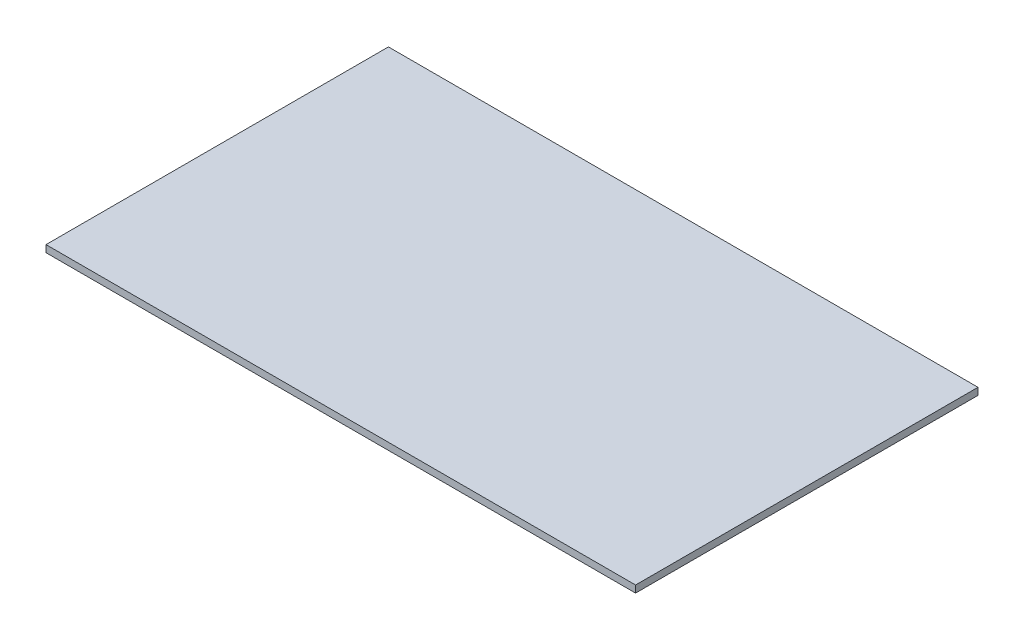
ISO-10303-21;
HEADER;
FILE_DESCRIPTION(('STEP AP214'),'2;1');
FILE_NAME('part.step','',(''),(''),'','','');
FILE_SCHEMA(('AUTOMOTIVE_DESIGN { 1 0 10303 214 1 1 1 1 }'));
ENDSEC;
DATA;
#1=APPLICATION_CONTEXT('core data for automotive mechanical design processes');
#2=APPLICATION_PROTOCOL_DEFINITION('international standard','automotive_design',2000,#1);
#3=PRODUCT_CONTEXT('',#1,'mechanical');
#4=PRODUCT('Part','Part','',(#3));
#5=PRODUCT_RELATED_PRODUCT_CATEGORY('part','',(#4));
#6=PRODUCT_DEFINITION_FORMATION('','',#4);
#7=PRODUCT_DEFINITION_CONTEXT('part definition',#1,'design');
#8=PRODUCT_DEFINITION('design','',#6,#7);
#9=PRODUCT_DEFINITION_SHAPE('','',#8);
#10=(LENGTH_UNIT() NAMED_UNIT(*) SI_UNIT(.MILLI.,.METRE.));
#11=(NAMED_UNIT(*) PLANE_ANGLE_UNIT() SI_UNIT($,.RADIAN.));
#12=(NAMED_UNIT(*) SI_UNIT($,.STERADIAN.) SOLID_ANGLE_UNIT());
#13=UNCERTAINTY_MEASURE_WITH_UNIT(LENGTH_MEASURE(1.E-05),#10,'distance_accuracy_value','');
#14=(GEOMETRIC_REPRESENTATION_CONTEXT(3) GLOBAL_UNCERTAINTY_ASSIGNED_CONTEXT((#13)) GLOBAL_UNIT_ASSIGNED_CONTEXT((#10,
#11,#12)) REPRESENTATION_CONTEXT('',''));
#15=CARTESIAN_POINT('',(0.,0.,0.));
#16=DIRECTION('',(0.,0.,1.));
#17=DIRECTION('',(1.,0.,0.));
#18=AXIS2_PLACEMENT_3D('',#15,#16,#17);
#19=CARTESIAN_POINT('',(0.,0.6,0.));
#20=DIRECTION('',(1.,0.,0.));
#21=DIRECTION('',(0.,0.,-1.));
#22=AXIS2_PLACEMENT_3D('',#19,#20,#21);
#23=PLANE('',#22);
#24=DIRECTION('',(0.,0.,1.));
#25=VECTOR('',#24,1.);
#26=CARTESIAN_POINT('',(0.,0.,0.));
#27=LINE('',#26,#25);
#28=CARTESIAN_POINT('',(0.,0.,-29.21));
#29=VERTEX_POINT('',#28);
#30=CARTESIAN_POINT('',(0.,0.,0.));
#31=VERTEX_POINT('',#30);
#32=EDGE_CURVE('E108',#29,#31,#27,.T.);
#33=ORIENTED_EDGE('',*,*,#32,.T.);
#34=DIRECTION('',(0.,-1.,0.));
#35=VECTOR('',#34,1.);
#36=CARTESIAN_POINT('',(0.,0.6,0.));
#37=LINE('',#36,#35);
#38=CARTESIAN_POINT('',(0.,0.6,0.));
#39=VERTEX_POINT('',#38);
#40=EDGE_CURVE('E11',#39,#31,#37,.T.);
#41=ORIENTED_EDGE('',*,*,#40,.F.);
#42=DIRECTION('',(0.,0.,1.));
#43=VECTOR('',#42,1.);
#44=CARTESIAN_POINT('',(0.,0.6,0.));
#45=LINE('',#44,#43);
#46=CARTESIAN_POINT('',(0.,0.6,-29.21));
#47=VERTEX_POINT('',#46);
#48=EDGE_CURVE('E96',#47,#39,#45,.T.);
#49=ORIENTED_EDGE('',*,*,#48,.F.);
#50=DIRECTION('',(0.,-1.,0.));
#51=VECTOR('',#50,1.);
#52=CARTESIAN_POINT('',(0.,0.6,-29.21));
#53=LINE('',#52,#51);
#54=EDGE_CURVE('E104',#47,#29,#53,.T.);
#55=ORIENTED_EDGE('',*,*,#54,.T.);
#56=EDGE_LOOP('',(#33,#41,#49,#55));
#57=FACE_BOUND('',#56,.T.);
#58=ADVANCED_FACE('F45',(#57),#23,.F.);
#59=CARTESIAN_POINT('',(0.,0.6,0.));
#60=DIRECTION('',(0.,0.,-1.));
#61=DIRECTION('',(-1.,0.,0.));
#62=AXIS2_PLACEMENT_3D('',#59,#60,#61);
#63=PLANE('',#62);
#64=DIRECTION('',(1.,0.,0.));
#65=VECTOR('',#64,1.);
#66=CARTESIAN_POINT('',(0.,0.,0.));
#67=LINE('',#66,#65);
#68=CARTESIAN_POINT('',(50.292,0.,0.));
#69=VERTEX_POINT('',#68);
#70=EDGE_CURVE('E100',#31,#69,#67,.T.);
#71=ORIENTED_EDGE('',*,*,#70,.T.);
#72=DIRECTION('',(0.,-1.,0.));
#73=VECTOR('',#72,1.);
#74=CARTESIAN_POINT('',(50.292,0.6,0.));
#75=LINE('',#74,#73);
#76=CARTESIAN_POINT('',(50.292,0.6,0.));
#77=VERTEX_POINT('',#76);
#78=EDGE_CURVE('E53',#77,#69,#75,.T.);
#79=ORIENTED_EDGE('',*,*,#78,.F.);
#80=DIRECTION('',(1.,0.,0.));
#81=VECTOR('',#80,1.);
#82=CARTESIAN_POINT('',(0.,0.6,0.));
#83=LINE('',#82,#81);
#84=EDGE_CURVE('E91',#39,#77,#83,.T.);
#85=ORIENTED_EDGE('',*,*,#84,.F.);
#86=ORIENTED_EDGE('',*,*,#40,.T.);
#87=EDGE_LOOP('',(#71,#79,#85,#86));
#88=FACE_BOUND('',#87,.T.);
#89=ADVANCED_FACE('F99',(#88),#63,.F.);
#90=CARTESIAN_POINT('',(50.292,0.6,0.));
#91=DIRECTION('',(-1.,0.,0.));
#92=DIRECTION('',(0.,0.,1.));
#93=AXIS2_PLACEMENT_3D('',#90,#91,#92);
#94=PLANE('',#93);
#95=DIRECTION('',(0.,0.,-1.));
#96=VECTOR('',#95,1.);
#97=CARTESIAN_POINT('',(50.292,0.,0.));
#98=LINE('',#97,#96);
#99=CARTESIAN_POINT('',(50.292,0.,-29.21));
#100=VERTEX_POINT('',#99);
#101=EDGE_CURVE('E78',#69,#100,#98,.T.);
#102=ORIENTED_EDGE('',*,*,#101,.T.);
#103=DIRECTION('',(0.,-1.,0.));
#104=VECTOR('',#103,1.);
#105=CARTESIAN_POINT('',(50.292,0.6,-29.21));
#106=LINE('',#105,#104);
#107=CARTESIAN_POINT('',(50.292,0.6,-29.21));
#108=VERTEX_POINT('',#107);
#109=EDGE_CURVE('E101',#108,#100,#106,.T.);
#110=ORIENTED_EDGE('',*,*,#109,.F.);
#111=DIRECTION('',(0.,0.,-1.));
#112=VECTOR('',#111,1.);
#113=CARTESIAN_POINT('',(50.292,0.6,0.));
#114=LINE('',#113,#112);
#115=EDGE_CURVE('E94',#77,#108,#114,.T.);
#116=ORIENTED_EDGE('',*,*,#115,.F.);
#117=ORIENTED_EDGE('',*,*,#78,.T.);
#118=EDGE_LOOP('',(#102,#110,#116,#117));
#119=FACE_BOUND('',#118,.T.);
#120=ADVANCED_FACE('F102',(#119),#94,.F.);
#121=CARTESIAN_POINT('',(0.,0.6,-29.21));
#122=DIRECTION('',(0.,0.,1.));
#123=DIRECTION('',(1.,0.,0.));
#124=AXIS2_PLACEMENT_3D('',#121,#122,#123);
#125=PLANE('',#124);
#126=DIRECTION('',(-1.,0.,0.));
#127=VECTOR('',#126,1.);
#128=CARTESIAN_POINT('',(0.,0.,-29.21));
#129=LINE('',#128,#127);
#130=EDGE_CURVE('E84',#100,#29,#129,.T.);
#131=ORIENTED_EDGE('',*,*,#130,.T.);
#132=ORIENTED_EDGE('',*,*,#54,.F.);
#133=DIRECTION('',(-1.,0.,0.));
#134=VECTOR('',#133,1.);
#135=CARTESIAN_POINT('',(0.,0.6,-29.21));
#136=LINE('',#135,#134);
#137=EDGE_CURVE('E61',#108,#47,#136,.T.);
#138=ORIENTED_EDGE('',*,*,#137,.F.);
#139=ORIENTED_EDGE('',*,*,#109,.T.);
#140=EDGE_LOOP('',(#131,#132,#138,#139));
#141=FACE_BOUND('',#140,.T.);
#142=ADVANCED_FACE('F115',(#141),#125,.F.);
#143=CARTESIAN_POINT('',(0.,0.6,0.));
#144=DIRECTION('',(0.,-1.,0.));
#145=DIRECTION('',(0.,0.,-1.));
#146=AXIS2_PLACEMENT_3D('',#143,#144,#145);
#147=PLANE('',#146);
#148=ORIENTED_EDGE('',*,*,#48,.T.);
#149=ORIENTED_EDGE('',*,*,#84,.T.);
#150=ORIENTED_EDGE('',*,*,#115,.T.);
#151=ORIENTED_EDGE('',*,*,#137,.T.);
#152=EDGE_LOOP('',(#148,#149,#150,#151));
#153=FACE_BOUND('',#152,.T.);
#154=ADVANCED_FACE('F92',(#153),#147,.F.);
#155=CARTESIAN_POINT('',(0.,0.,0.));
#156=DIRECTION('',(0.,-1.,0.));
#157=DIRECTION('',(0.,0.,-1.));
#158=AXIS2_PLACEMENT_3D('',#155,#156,#157);
#159=PLANE('',#158);
#160=ORIENTED_EDGE('',*,*,#32,.F.);
#161=ORIENTED_EDGE('',*,*,#130,.F.);
#162=ORIENTED_EDGE('',*,*,#101,.F.);
#163=ORIENTED_EDGE('',*,*,#70,.F.);
#164=EDGE_LOOP('',(#160,#161,#162,#163));
#165=FACE_BOUND('',#164,.T.);
#166=ADVANCED_FACE('F118',(#165),#159,.T.);
#167=CLOSED_SHELL('',(#58,#89,#120,#142,#154,#166));
#168=MANIFOLD_SOLID_BREP('B2',#167);
#169=ADVANCED_BREP_SHAPE_REPRESENTATION('',(#18,#168),#14);
#170=SHAPE_DEFINITION_REPRESENTATION(#9,#169);
ENDSEC;
END-ISO-10303-21;
